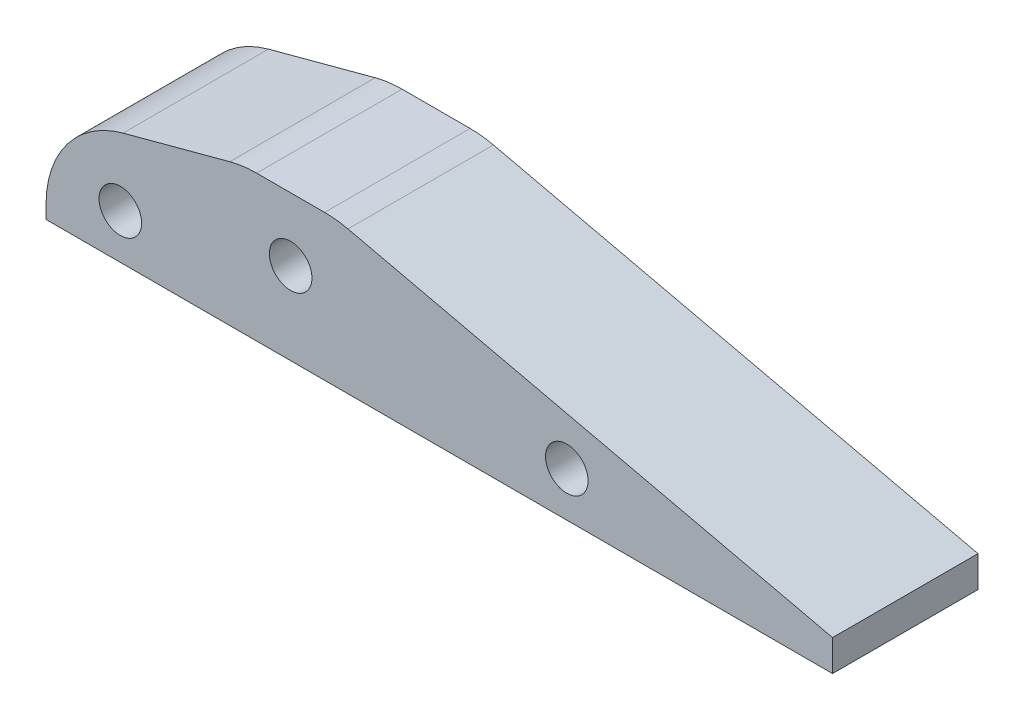
ISO-10303-21;
HEADER;
FILE_DESCRIPTION(('STEP AP214'),'2;1');
FILE_NAME('part.step','',(''),(''),'','','');
FILE_SCHEMA(('AUTOMOTIVE_DESIGN { 1 0 10303 214 1 1 1 1 }'));
ENDSEC;
DATA;
#1=APPLICATION_CONTEXT('core data for automotive mechanical design processes');
#2=APPLICATION_PROTOCOL_DEFINITION('international standard','automotive_design',2000,#1);
#3=PRODUCT_CONTEXT('',#1,'mechanical');
#4=PRODUCT('Part','Part','',(#3));
#5=PRODUCT_RELATED_PRODUCT_CATEGORY('part','',(#4));
#6=PRODUCT_DEFINITION_FORMATION('','',#4);
#7=PRODUCT_DEFINITION_CONTEXT('part definition',#1,'design');
#8=PRODUCT_DEFINITION('design','',#6,#7);
#9=PRODUCT_DEFINITION_SHAPE('','',#8);
#10=(LENGTH_UNIT() NAMED_UNIT(*) SI_UNIT(.MILLI.,.METRE.));
#11=(NAMED_UNIT(*) PLANE_ANGLE_UNIT() SI_UNIT($,.RADIAN.));
#12=(NAMED_UNIT(*) SI_UNIT($,.STERADIAN.) SOLID_ANGLE_UNIT());
#13=UNCERTAINTY_MEASURE_WITH_UNIT(LENGTH_MEASURE(1.E-05),#10,'distance_accuracy_value','');
#14=(GEOMETRIC_REPRESENTATION_CONTEXT(3) GLOBAL_UNCERTAINTY_ASSIGNED_CONTEXT((#13)) GLOBAL_UNIT_ASSIGNED_CONTEXT((#10,
#11,#12)) REPRESENTATION_CONTEXT('',''));
#15=CARTESIAN_POINT('',(0.,0.,0.));
#16=DIRECTION('',(0.,0.,1.));
#17=DIRECTION('',(1.,0.,0.));
#18=AXIS2_PLACEMENT_3D('',#15,#16,#17);
#19=CARTESIAN_POINT('',(75.7081636477034,0.,14.));
#20=DIRECTION('',(0.,1.,0.));
#21=DIRECTION('',(-1.,0.,0.));
#22=AXIS2_PLACEMENT_3D('',#19,#20,#21);
#23=PLANE('',#22);
#24=DIRECTION('',(1.,0.,0.));
#25=VECTOR('',#24,1.);
#26=CARTESIAN_POINT('',(75.7081636477034,0.,0.));
#27=LINE('',#26,#25);
#28=CARTESIAN_POINT('',(0.,0.,0.));
#29=VERTEX_POINT('',#28);
#30=CARTESIAN_POINT('',(75.7081636477034,0.,0.));
#31=VERTEX_POINT('',#30);
#32=EDGE_CURVE('E355',#29,#31,#27,.T.);
#33=ORIENTED_EDGE('',*,*,#32,.T.);
#34=DIRECTION('',(0.,0.,-1.));
#35=VECTOR('',#34,1.);
#36=CARTESIAN_POINT('',(75.7081636477034,0.,14.));
#37=LINE('',#36,#35);
#38=CARTESIAN_POINT('',(75.7081636477034,0.,14.));
#39=VERTEX_POINT('',#38);
#40=EDGE_CURVE('E401',#39,#31,#37,.T.);
#41=ORIENTED_EDGE('',*,*,#40,.F.);
#42=DIRECTION('',(1.,0.,0.));
#43=VECTOR('',#42,1.);
#44=CARTESIAN_POINT('',(75.7081636477034,0.,14.));
#45=LINE('',#44,#43);
#46=CARTESIAN_POINT('',(0.,0.,14.));
#47=VERTEX_POINT('',#46);
#48=EDGE_CURVE('E366',#47,#39,#45,.T.);
#49=ORIENTED_EDGE('',*,*,#48,.F.);
#50=DIRECTION('',(0.,0.,-1.));
#51=VECTOR('',#50,1.);
#52=CARTESIAN_POINT('',(0.,0.,14.));
#53=LINE('',#52,#51);
#54=EDGE_CURVE('E382',#47,#29,#53,.T.);
#55=ORIENTED_EDGE('',*,*,#54,.T.);
#56=EDGE_LOOP('',(#33,#41,#49,#55));
#57=FACE_BOUND('',#56,.T.);
#58=ADVANCED_FACE('F34',(#57),#23,.F.);
#59=CARTESIAN_POINT('',(75.7081636477034,3.,14.));
#60=DIRECTION('',(-1.,0.,0.));
#61=DIRECTION('',(0.,0.,1.));
#62=AXIS2_PLACEMENT_3D('',#59,#60,#61);
#63=PLANE('',#62);
#64=DIRECTION('',(0.,1.,0.));
#65=VECTOR('',#64,1.);
#66=CARTESIAN_POINT('',(75.7081636477034,3.,0.));
#67=LINE('',#66,#65);
#68=CARTESIAN_POINT('',(75.7081636477034,3.,0.));
#69=VERTEX_POINT('',#68);
#70=EDGE_CURVE('E385',#31,#69,#67,.T.);
#71=ORIENTED_EDGE('',*,*,#70,.T.);
#72=DIRECTION('',(0.,0.,-1.));
#73=VECTOR('',#72,1.);
#74=CARTESIAN_POINT('',(75.7081636477034,3.,14.));
#75=LINE('',#74,#73);
#76=CARTESIAN_POINT('',(75.7081636477034,3.,14.));
#77=VERTEX_POINT('',#76);
#78=EDGE_CURVE('E398',#77,#69,#75,.T.);
#79=ORIENTED_EDGE('',*,*,#78,.F.);
#80=DIRECTION('',(0.,1.,0.));
#81=VECTOR('',#80,1.);
#82=CARTESIAN_POINT('',(75.7081636477034,3.,14.));
#83=LINE('',#82,#81);
#84=EDGE_CURVE('E369',#39,#77,#83,.T.);
#85=ORIENTED_EDGE('',*,*,#84,.F.);
#86=ORIENTED_EDGE('',*,*,#40,.T.);
#87=EDGE_LOOP('',(#71,#79,#85,#86));
#88=FACE_BOUND('',#87,.T.);
#89=ADVANCED_FACE('F448',(#88),#63,.F.);
#90=CARTESIAN_POINT('',(27.9588181024501,14.,14.));
#91=DIRECTION('',(-0.224489795918367,-0.974476439699047,0.));
#92=DIRECTION('',(0.974476439699047,-0.224489795918367,0.));
#93=AXIS2_PLACEMENT_3D('',#90,#91,#92);
#94=PLANE('',#93);
#95=DIRECTION('',(-0.974476439699047,0.224489795918367,0.));
#96=VECTOR('',#95,1.);
#97=CARTESIAN_POINT('',(27.9588181024501,14.,0.));
#98=LINE('',#97,#96);
#99=CARTESIAN_POINT('',(29.0667574664095,13.7447643969905,0.));
#100=VERTEX_POINT('',#99);
#101=EDGE_CURVE('E387',#69,#100,#98,.T.);
#102=ORIENTED_EDGE('',*,*,#101,.T.);
#103=DIRECTION('',(0.,0.,-1.));
#104=VECTOR('',#103,1.);
#105=CARTESIAN_POINT('',(29.0667574664095,13.7447643969905,14.));
#106=LINE('',#105,#104);
#107=CARTESIAN_POINT('',(29.0667574664095,13.7447643969905,14.));
#108=VERTEX_POINT('',#107);
#109=EDGE_CURVE('E424',#100,#108,#106,.F.);
#110=ORIENTED_EDGE('',*,*,#109,.T.);
#111=DIRECTION('',(-0.974476439699047,0.224489795918367,0.));
#112=VECTOR('',#111,1.);
#113=CARTESIAN_POINT('',(27.9588181024501,14.,14.));
#114=LINE('',#113,#112);
#115=EDGE_CURVE('E372',#77,#108,#114,.T.);
#116=ORIENTED_EDGE('',*,*,#115,.F.);
#117=ORIENTED_EDGE('',*,*,#78,.T.);
#118=EDGE_LOOP('',(#102,#110,#116,#117));
#119=FACE_BOUND('',#118,.T.);
#120=ADVANCED_FACE('F445',(#119),#94,.F.);
#121=CARTESIAN_POINT('',(18.9588181024501,14.,14.));
#122=DIRECTION('',(0.,-1.,0.));
#123=DIRECTION('',(0.,0.,-1.));
#124=AXIS2_PLACEMENT_3D('',#121,#122,#123);
#125=PLANE('',#124);
#126=DIRECTION('',(-1.,0.,0.));
#127=VECTOR('',#126,1.);
#128=CARTESIAN_POINT('',(18.9588181024501,14.,14.));
#129=LINE('',#128,#127);
#130=CARTESIAN_POINT('',(26.8218595072258,14.,14.));
#131=VERTEX_POINT('',#130);
#132=CARTESIAN_POINT('',(20.275343078324,14.,14.));
#133=VERTEX_POINT('',#132);
#134=EDGE_CURVE('E375',#131,#133,#129,.T.);
#135=ORIENTED_EDGE('',*,*,#134,.F.);
#136=DIRECTION('',(0.,0.,-1.));
#137=VECTOR('',#136,1.);
#138=CARTESIAN_POINT('',(26.8218595072258,14.,14.));
#139=LINE('',#138,#137);
#140=CARTESIAN_POINT('',(26.8218595072258,14.,0.));
#141=VERTEX_POINT('',#140);
#142=EDGE_CURVE('E417',#131,#141,#139,.T.);
#143=ORIENTED_EDGE('',*,*,#142,.T.);
#144=DIRECTION('',(-1.,0.,0.));
#145=VECTOR('',#144,1.);
#146=CARTESIAN_POINT('',(18.9588181024501,14.,0.));
#147=LINE('',#146,#145);
#148=CARTESIAN_POINT('',(20.275343078324,14.,0.));
#149=VERTEX_POINT('',#148);
#150=EDGE_CURVE('E390',#141,#149,#147,.T.);
#151=ORIENTED_EDGE('',*,*,#150,.T.);
#152=DIRECTION('',(0.,0.,-1.));
#153=VECTOR('',#152,1.);
#154=CARTESIAN_POINT('',(20.275343078324,14.,14.));
#155=LINE('',#154,#153);
#156=EDGE_CURVE('E415',#149,#133,#155,.F.);
#157=ORIENTED_EDGE('',*,*,#156,.T.);
#158=EDGE_LOOP('',(#135,#143,#151,#157));
#159=FACE_BOUND('',#158,.T.);
#160=ADVANCED_FACE('F437',(#159),#125,.F.);
#161=CARTESIAN_POINT('',(0.,8.92,14.));
#162=DIRECTION('',(0.258819045102518,-0.965925826289069,0.));
#163=DIRECTION('',(0.965925826289069,0.258819045102518,0.));
#164=AXIS2_PLACEMENT_3D('',#161,#162,#163);
#165=PLANE('',#164);
#166=DIRECTION('',(-0.965925826289069,-0.258819045102518,0.));
#167=VECTOR('',#166,1.);
#168=CARTESIAN_POINT('',(0.,8.92,14.));
#169=LINE('',#168,#167);
#170=CARTESIAN_POINT('',(17.6871526272989,13.6592582628907,14.));
#171=VERTEX_POINT('',#170);
#172=CARTESIAN_POINT('',(7.41180954897482,10.9059883831011,14.));
#173=VERTEX_POINT('',#172);
#174=EDGE_CURVE('E378',#171,#173,#169,.T.);
#175=ORIENTED_EDGE('',*,*,#174,.F.);
#176=DIRECTION('',(0.,0.,-1.));
#177=VECTOR('',#176,1.);
#178=CARTESIAN_POINT('',(17.6871526272989,13.6592582628907,14.));
#179=LINE('',#178,#177);
#180=CARTESIAN_POINT('',(17.6871526272989,13.6592582628907,0.));
#181=VERTEX_POINT('',#180);
#182=EDGE_CURVE('E11',#171,#181,#179,.T.);
#183=ORIENTED_EDGE('',*,*,#182,.T.);
#184=DIRECTION('',(-0.965925826289069,-0.258819045102518,0.));
#185=VECTOR('',#184,1.);
#186=CARTESIAN_POINT('',(0.,8.92,0.));
#187=LINE('',#186,#185);
#188=CARTESIAN_POINT('',(7.41180954897482,10.9059883831011,0.));
#189=VERTEX_POINT('',#188);
#190=EDGE_CURVE('E393',#181,#189,#187,.T.);
#191=ORIENTED_EDGE('',*,*,#190,.T.);
#192=DIRECTION('',(0.,0.,-1.));
#193=VECTOR('',#192,1.);
#194=CARTESIAN_POINT('',(7.41180954897482,10.9059883831011,14.));
#195=LINE('',#194,#193);
#196=EDGE_CURVE('E410',#189,#173,#195,.F.);
#197=ORIENTED_EDGE('',*,*,#196,.T.);
#198=EDGE_LOOP('',(#175,#183,#191,#197));
#199=FACE_BOUND('',#198,.T.);
#200=ADVANCED_FACE('F466',(#199),#165,.F.);
#201=CARTESIAN_POINT('',(0.,0.,14.));
#202=DIRECTION('',(1.,0.,0.));
#203=DIRECTION('',(0.,0.,-1.));
#204=AXIS2_PLACEMENT_3D('',#201,#202,#203);
#205=PLANE('',#204);
#206=DIRECTION('',(0.,-1.,0.));
#207=VECTOR('',#206,1.);
#208=CARTESIAN_POINT('',(0.,0.,14.));
#209=LINE('',#208,#207);
#210=CARTESIAN_POINT('',(0.,1.24673012021037,14.));
#211=VERTEX_POINT('',#210);
#212=EDGE_CURVE('E380',#211,#47,#209,.T.);
#213=ORIENTED_EDGE('',*,*,#212,.F.);
#214=DIRECTION('',(0.,0.,-1.));
#215=VECTOR('',#214,1.);
#216=CARTESIAN_POINT('',(0.,1.24673012021037,14.));
#217=LINE('',#216,#215);
#218=CARTESIAN_POINT('',(0.,1.24673012021037,0.));
#219=VERTEX_POINT('',#218);
#220=EDGE_CURVE('E404',#211,#219,#217,.T.);
#221=ORIENTED_EDGE('',*,*,#220,.T.);
#222=DIRECTION('',(0.,-1.,0.));
#223=VECTOR('',#222,1.);
#224=CARTESIAN_POINT('',(0.,0.,0.));
#225=LINE('',#224,#223);
#226=EDGE_CURVE('E370',#219,#29,#225,.T.);
#227=ORIENTED_EDGE('',*,*,#226,.T.);
#228=ORIENTED_EDGE('',*,*,#54,.F.);
#229=EDGE_LOOP('',(#213,#221,#227,#228));
#230=FACE_BOUND('',#229,.T.);
#231=ADVANCED_FACE('F457',(#230),#205,.F.);
#232=CARTESIAN_POINT('',(0.,0.,14.));
#233=DIRECTION('',(0.,0.,-1.));
#234=DIRECTION('',(-1.,0.,0.));
#235=AXIS2_PLACEMENT_3D('',#232,#233,#234);
#236=PLANE('',#235);
#237=CARTESIAN_POINT('',(23.5486012927749,7.90688835550412,14.));
#238=DIRECTION('',(0.,0.,-1.));
#239=DIRECTION('',(-1.,0.,0.));
#240=AXIS2_PLACEMENT_3D('',#237,#238,#239);
#241=CIRCLE('',#240,2.05);
#242=CARTESIAN_POINT('',(21.4986012927749,7.90688835550412,14.));
#243=VERTEX_POINT('',#242);
#244=EDGE_CURVE('E823',#243,#243,#241,.T.);
#245=ORIENTED_EDGE('',*,*,#244,.T.);
#246=EDGE_LOOP('',(#245));
#247=FACE_BOUND('',#246,.T.);
#248=CARTESIAN_POINT('',(7.15500446756323,4.29359135241486,14.));
#249=DIRECTION('',(0.,0.,-1.));
#250=DIRECTION('',(-1.,0.,0.));
#251=AXIS2_PLACEMENT_3D('',#248,#249,#250);
#252=CIRCLE('',#251,2.05);
#253=CARTESIAN_POINT('',(5.10500446756323,4.29359135241486,14.));
#254=VERTEX_POINT('',#253);
#255=EDGE_CURVE('E811',#254,#254,#252,.T.);
#256=ORIENTED_EDGE('',*,*,#255,.T.);
#257=EDGE_LOOP('',(#256));
#258=FACE_BOUND('',#257,.T.);
#259=CARTESIAN_POINT('',(50.1296462146624,4.29359135241486,14.));
#260=DIRECTION('',(0.,0.,-1.));
#261=DIRECTION('',(-1.,0.,0.));
#262=AXIS2_PLACEMENT_3D('',#259,#260,#261);
#263=CIRCLE('',#262,2.04999999999999);
#264=CARTESIAN_POINT('',(48.0796462146624,4.29359135241486,14.));
#265=VERTEX_POINT('',#264);
#266=EDGE_CURVE('E294',#265,#265,#263,.T.);
#267=ORIENTED_EDGE('',*,*,#266,.T.);
#268=EDGE_LOOP('',(#267));
#269=FACE_BOUND('',#268,.T.);
#270=ORIENTED_EDGE('',*,*,#115,.T.);
#271=CARTESIAN_POINT('',(26.8218595072258,3.99999999999999,14.));
#272=DIRECTION('',(0.,0.,-1.));
#273=DIRECTION('',(-1.,0.,0.));
#274=AXIS2_PLACEMENT_3D('',#271,#272,#273);
#275=CIRCLE('',#274,10.);
#276=EDGE_CURVE('E42',#108,#131,#275,.F.);
#277=ORIENTED_EDGE('',*,*,#276,.T.);
#278=ORIENTED_EDGE('',*,*,#134,.T.);
#279=CARTESIAN_POINT('',(20.275343078324,3.99999999999999,14.));
#280=DIRECTION('',(0.,0.,-1.));
#281=DIRECTION('',(-1.,0.,0.));
#282=AXIS2_PLACEMENT_3D('',#279,#280,#281);
#283=CIRCLE('',#282,10.);
#284=EDGE_CURVE('E426',#133,#171,#283,.F.);
#285=ORIENTED_EDGE('',*,*,#284,.T.);
#286=ORIENTED_EDGE('',*,*,#174,.T.);
#287=CARTESIAN_POINT('',(10.,1.24673012021037,14.));
#288=DIRECTION('',(0.,0.,-1.));
#289=DIRECTION('',(-1.,0.,0.));
#290=AXIS2_PLACEMENT_3D('',#287,#288,#289);
#291=CIRCLE('',#290,10.);
#292=EDGE_CURVE('E413',#173,#211,#291,.F.);
#293=ORIENTED_EDGE('',*,*,#292,.T.);
#294=ORIENTED_EDGE('',*,*,#212,.T.);
#295=ORIENTED_EDGE('',*,*,#48,.T.);
#296=ORIENTED_EDGE('',*,*,#84,.T.);
#297=EDGE_LOOP('',(#270,#277,#278,#285,#286,#293,#294,#295,#296));
#298=FACE_BOUND('',#297,.T.);
#299=ADVANCED_FACE('F430',(#247,#258,#269,#298),#236,.F.);
#300=CARTESIAN_POINT('',(0.,0.,0.));
#301=DIRECTION('',(0.,0.,-1.));
#302=DIRECTION('',(-1.,0.,0.));
#303=AXIS2_PLACEMENT_3D('',#300,#301,#302);
#304=PLANE('',#303);
#305=DIRECTION('',(1.,0.,0.));
#306=VECTOR('',#305,1.);
#307=CARTESIAN_POINT('',(21.4990078371518,11.4568883555041,0.));
#308=LINE('',#307,#306);
#309=CARTESIAN_POINT('',(21.4990078371518,11.4568883555041,0.));
#310=VERTEX_POINT('',#309);
#311=CARTESIAN_POINT('',(25.5981947483981,11.4568883555041,0.));
#312=VERTEX_POINT('',#311);
#313=EDGE_CURVE('E49',#310,#312,#308,.T.);
#314=ORIENTED_EDGE('',*,*,#313,.F.);
#315=DIRECTION('',(0.500000000000008,0.866025403784434,0.));
#316=VECTOR('',#315,1.);
#317=CARTESIAN_POINT('',(19.4494143815286,7.90688835550415,0.));
#318=LINE('',#317,#316);
#319=CARTESIAN_POINT('',(19.4494143815286,7.90688835550415,0.));
#320=VERTEX_POINT('',#319);
#321=EDGE_CURVE('E234',#320,#310,#318,.T.);
#322=ORIENTED_EDGE('',*,*,#321,.F.);
#323=DIRECTION('',(-0.499999999999994,0.866025403784442,0.));
#324=VECTOR('',#323,1.);
#325=CARTESIAN_POINT('',(21.4990078371517,4.35688835550413,0.));
#326=LINE('',#325,#324);
#327=CARTESIAN_POINT('',(21.4990078371517,4.35688835550413,0.));
#328=VERTEX_POINT('',#327);
#329=EDGE_CURVE('E237',#328,#320,#326,.T.);
#330=ORIENTED_EDGE('',*,*,#329,.F.);
#331=DIRECTION('',(-1.,0.,0.));
#332=VECTOR('',#331,1.);
#333=CARTESIAN_POINT('',(25.5981947483981,4.35688835550411,0.));
#334=LINE('',#333,#332);
#335=CARTESIAN_POINT('',(25.5981947483981,4.35688835550411,0.));
#336=VERTEX_POINT('',#335);
#337=EDGE_CURVE('E257',#336,#328,#334,.T.);
#338=ORIENTED_EDGE('',*,*,#337,.F.);
#339=DIRECTION('',(-0.500000000000003,-0.866025403784437,0.));
#340=VECTOR('',#339,1.);
#341=CARTESIAN_POINT('',(27.6477882040213,7.90688835550411,0.));
#342=LINE('',#341,#340);
#343=CARTESIAN_POINT('',(27.6477882040213,7.90688835550411,0.));
#344=VERTEX_POINT('',#343);
#345=EDGE_CURVE('E254',#344,#336,#342,.T.);
#346=ORIENTED_EDGE('',*,*,#345,.F.);
#347=DIRECTION('',(0.5,-0.866025403784439,0.));
#348=VECTOR('',#347,1.);
#349=CARTESIAN_POINT('',(25.5981947483981,11.4568883555041,0.));
#350=LINE('',#349,#348);
#351=EDGE_CURVE('E251',#312,#344,#350,.T.);
#352=ORIENTED_EDGE('',*,*,#351,.F.);
#353=EDGE_LOOP('',(#314,#322,#330,#338,#346,#352));
#354=FACE_BOUND('',#353,.T.);
#355=DIRECTION('',(1.,0.,0.));
#356=VECTOR('',#355,1.);
#357=CARTESIAN_POINT('',(5.1054110119401,7.84359135241489,0.));
#358=LINE('',#357,#356);
#359=CARTESIAN_POINT('',(5.1054110119401,7.84359135241489,0.));
#360=VERTEX_POINT('',#359);
#361=CARTESIAN_POINT('',(9.2045979231864,7.84359135241486,0.));
#362=VERTEX_POINT('',#361);
#363=EDGE_CURVE('E57',#360,#362,#358,.T.);
#364=ORIENTED_EDGE('',*,*,#363,.F.);
#365=DIRECTION('',(0.50000000000001,0.866025403784433,0.));
#366=VECTOR('',#365,1.);
#367=CARTESIAN_POINT('',(3.05581755631689,4.2935913524149,0.));
#368=LINE('',#367,#366);
#369=CARTESIAN_POINT('',(3.05581755631689,4.2935913524149,0.));
#370=VERTEX_POINT('',#369);
#371=EDGE_CURVE('E276',#370,#360,#368,.T.);
#372=ORIENTED_EDGE('',*,*,#371,.F.);
#373=DIRECTION('',(-0.499999999999993,0.866025403784443,0.));
#374=VECTOR('',#373,1.);
#375=CARTESIAN_POINT('',(5.10541101194003,0.743591352414876,0.));
#376=LINE('',#375,#374);
#377=CARTESIAN_POINT('',(5.10541101194003,0.743591352414876,0.));
#378=VERTEX_POINT('',#377);
#379=EDGE_CURVE('E303',#378,#370,#376,.T.);
#380=ORIENTED_EDGE('',*,*,#379,.F.);
#381=DIRECTION('',(-1.,0.,0.));
#382=VECTOR('',#381,1.);
#383=CARTESIAN_POINT('',(9.20459792318639,0.74359135241485,0.));
#384=LINE('',#383,#382);
#385=CARTESIAN_POINT('',(9.20459792318639,0.74359135241485,0.));
#386=VERTEX_POINT('',#385);
#387=EDGE_CURVE('E300',#386,#378,#384,.T.);
#388=ORIENTED_EDGE('',*,*,#387,.F.);
#389=DIRECTION('',(-0.500000000000003,-0.866025403784437,0.));
#390=VECTOR('',#389,1.);
#391=CARTESIAN_POINT('',(11.2541913788096,4.29359135241485,0.));
#392=LINE('',#391,#390);
#393=CARTESIAN_POINT('',(11.2541913788096,4.29359135241485,0.));
#394=VERTEX_POINT('',#393);
#395=EDGE_CURVE('E297',#394,#386,#392,.T.);
#396=ORIENTED_EDGE('',*,*,#395,.F.);
#397=DIRECTION('',(0.499999999999999,-0.866025403784439,0.));
#398=VECTOR('',#397,1.);
#399=CARTESIAN_POINT('',(9.2045979231864,7.84359135241486,0.));
#400=LINE('',#399,#398);
#401=EDGE_CURVE('E293',#362,#394,#400,.T.);
#402=ORIENTED_EDGE('',*,*,#401,.F.);
#403=EDGE_LOOP('',(#364,#372,#380,#388,#396,#402));
#404=FACE_BOUND('',#403,.T.);
#405=DIRECTION('',(1.,0.,0.));
#406=VECTOR('',#405,1.);
#407=CARTESIAN_POINT('',(48.0800527590393,7.8435913524149,0.));
#408=LINE('',#407,#406);
#409=CARTESIAN_POINT('',(48.0800527590393,7.8435913524149,0.));
#410=VERTEX_POINT('',#409);
#411=CARTESIAN_POINT('',(52.1792396702856,7.84359135241487,0.));
#412=VERTEX_POINT('',#411);
#413=EDGE_CURVE('E264',#410,#412,#408,.T.);
#414=ORIENTED_EDGE('',*,*,#413,.F.);
#415=DIRECTION('',(0.50000000000001,0.866025403784433,0.));
#416=VECTOR('',#415,1.);
#417=CARTESIAN_POINT('',(46.0304593034161,4.2935913524149,0.));
#418=LINE('',#417,#416);
#419=CARTESIAN_POINT('',(46.0304593034161,4.2935913524149,0.));
#420=VERTEX_POINT('',#419);
#421=EDGE_CURVE('E322',#420,#410,#418,.T.);
#422=ORIENTED_EDGE('',*,*,#421,.F.);
#423=DIRECTION('',(-0.499999999999992,0.866025403784443,0.));
#424=VECTOR('',#423,1.);
#425=CARTESIAN_POINT('',(48.0800527590392,0.743591352414869,0.));
#426=LINE('',#425,#424);
#427=CARTESIAN_POINT('',(48.0800527590392,0.743591352414869,0.));
#428=VERTEX_POINT('',#427);
#429=EDGE_CURVE('E348',#428,#420,#426,.T.);
#430=ORIENTED_EDGE('',*,*,#429,.F.);
#431=DIRECTION('',(-1.,0.,0.));
#432=VECTOR('',#431,1.);
#433=CARTESIAN_POINT('',(52.1792396702856,0.743591352414841,0.));
#434=LINE('',#433,#432);
#435=CARTESIAN_POINT('',(52.1792396702856,0.743591352414841,0.));
#436=VERTEX_POINT('',#435);
#437=EDGE_CURVE('E345',#436,#428,#434,.T.);
#438=ORIENTED_EDGE('',*,*,#437,.F.);
#439=DIRECTION('',(-0.500000000000003,-0.866025403784437,0.));
#440=VECTOR('',#439,1.);
#441=CARTESIAN_POINT('',(54.2288331259088,4.29359135241485,0.));
#442=LINE('',#441,#440);
#443=CARTESIAN_POINT('',(54.2288331259088,4.29359135241485,0.));
#444=VERTEX_POINT('',#443);
#445=EDGE_CURVE('E342',#444,#436,#442,.T.);
#446=ORIENTED_EDGE('',*,*,#445,.F.);
#447=DIRECTION('',(0.499999999999998,-0.86602540378444,0.));
#448=VECTOR('',#447,1.);
#449=CARTESIAN_POINT('',(52.1792396702856,7.84359135241487,0.));
#450=LINE('',#449,#448);
#451=EDGE_CURVE('E339',#412,#444,#450,.T.);
#452=ORIENTED_EDGE('',*,*,#451,.F.);
#453=EDGE_LOOP('',(#414,#422,#430,#438,#446,#452));
#454=FACE_BOUND('',#453,.T.);
#455=ORIENTED_EDGE('',*,*,#150,.F.);
#456=CARTESIAN_POINT('',(26.8218595072258,3.99999999999999,0.));
#457=DIRECTION('',(0.,0.,-1.));
#458=DIRECTION('',(-1.,0.,0.));
#459=AXIS2_PLACEMENT_3D('',#456,#457,#458);
#460=CIRCLE('',#459,10.);
#461=EDGE_CURVE('E422',#141,#100,#460,.T.);
#462=ORIENTED_EDGE('',*,*,#461,.T.);
#463=ORIENTED_EDGE('',*,*,#101,.F.);
#464=ORIENTED_EDGE('',*,*,#70,.F.);
#465=ORIENTED_EDGE('',*,*,#32,.F.);
#466=ORIENTED_EDGE('',*,*,#226,.F.);
#467=CARTESIAN_POINT('',(10.,1.24673012021037,0.));
#468=DIRECTION('',(0.,0.,-1.));
#469=DIRECTION('',(-1.,0.,0.));
#470=AXIS2_PLACEMENT_3D('',#467,#468,#469);
#471=CIRCLE('',#470,10.);
#472=EDGE_CURVE('E407',#219,#189,#471,.T.);
#473=ORIENTED_EDGE('',*,*,#472,.T.);
#474=ORIENTED_EDGE('',*,*,#190,.F.);
#475=CARTESIAN_POINT('',(20.275343078324,3.99999999999999,0.));
#476=DIRECTION('',(0.,0.,-1.));
#477=DIRECTION('',(-1.,0.,0.));
#478=AXIS2_PLACEMENT_3D('',#475,#476,#477);
#479=CIRCLE('',#478,10.);
#480=EDGE_CURVE('E420',#181,#149,#479,.T.);
#481=ORIENTED_EDGE('',*,*,#480,.T.);
#482=EDGE_LOOP('',(#455,#462,#463,#464,#465,#466,#473,#474,#481));
#483=FACE_BOUND('',#482,.T.);
#484=ADVANCED_FACE('F443',(#354,#404,#454,#483),#304,.T.);
#485=CARTESIAN_POINT('',(10.,1.24673012021037,14.));
#486=DIRECTION('',(0.,0.,-1.));
#487=DIRECTION('',(-1.,0.,0.));
#488=AXIS2_PLACEMENT_3D('',#485,#486,#487);
#489=CYLINDRICAL_SURFACE('',#488,10.);
#490=ORIENTED_EDGE('',*,*,#292,.F.);
#491=ORIENTED_EDGE('',*,*,#196,.F.);
#492=ORIENTED_EDGE('',*,*,#472,.F.);
#493=ORIENTED_EDGE('',*,*,#220,.F.);
#494=EDGE_LOOP('',(#490,#491,#492,#493));
#495=FACE_BOUND('',#494,.T.);
#496=ADVANCED_FACE('F461',(#495),#489,.T.);
#497=CARTESIAN_POINT('',(26.8218595072258,3.99999999999999,14.));
#498=DIRECTION('',(0.,0.,-1.));
#499=DIRECTION('',(-1.,0.,0.));
#500=AXIS2_PLACEMENT_3D('',#497,#498,#499);
#501=CYLINDRICAL_SURFACE('',#500,10.);
#502=ORIENTED_EDGE('',*,*,#276,.F.);
#503=ORIENTED_EDGE('',*,*,#109,.F.);
#504=ORIENTED_EDGE('',*,*,#461,.F.);
#505=ORIENTED_EDGE('',*,*,#142,.F.);
#506=EDGE_LOOP('',(#502,#503,#504,#505));
#507=FACE_BOUND('',#506,.T.);
#508=ADVANCED_FACE('F440',(#507),#501,.T.);
#509=CARTESIAN_POINT('',(20.275343078324,3.99999999999999,14.));
#510=DIRECTION('',(0.,0.,-1.));
#511=DIRECTION('',(-1.,0.,0.));
#512=AXIS2_PLACEMENT_3D('',#509,#510,#511);
#513=CYLINDRICAL_SURFACE('',#512,10.);
#514=ORIENTED_EDGE('',*,*,#284,.F.);
#515=ORIENTED_EDGE('',*,*,#156,.F.);
#516=ORIENTED_EDGE('',*,*,#480,.F.);
#517=ORIENTED_EDGE('',*,*,#182,.F.);
#518=EDGE_LOOP('',(#514,#515,#516,#517));
#519=FACE_BOUND('',#518,.T.);
#520=ADVANCED_FACE('F36',(#519),#513,.T.);
#521=CARTESIAN_POINT('',(48.0800527590393,7.8435913524149,5.));
#522=DIRECTION('',(0.,1.,0.));
#523=DIRECTION('',(-1.,0.,0.));
#524=AXIS2_PLACEMENT_3D('',#521,#522,#523);
#525=PLANE('',#524);
#526=ORIENTED_EDGE('',*,*,#413,.T.);
#527=DIRECTION('',(0.,0.,-1.));
#528=VECTOR('',#527,1.);
#529=CARTESIAN_POINT('',(52.1792396702856,7.84359135241487,5.));
#530=LINE('',#529,#528);
#531=CARTESIAN_POINT('',(52.1792396702856,7.84359135241487,5.));
#532=VERTEX_POINT('',#531);
#533=EDGE_CURVE('E337',#532,#412,#530,.T.);
#534=ORIENTED_EDGE('',*,*,#533,.F.);
#535=DIRECTION('',(1.,0.,0.));
#536=VECTOR('',#535,1.);
#537=CARTESIAN_POINT('',(48.0800527590393,7.8435913524149,5.));
#538=LINE('',#537,#536);
#539=CARTESIAN_POINT('',(48.0800527590393,7.8435913524149,5.));
#540=VERTEX_POINT('',#539);
#541=EDGE_CURVE('E318',#540,#532,#538,.T.);
#542=ORIENTED_EDGE('',*,*,#541,.F.);
#543=DIRECTION('',(0.,0.,-1.));
#544=VECTOR('',#543,1.);
#545=CARTESIAN_POINT('',(48.0800527590393,7.8435913524149,5.));
#546=LINE('',#545,#544);
#547=EDGE_CURVE('E353',#540,#410,#546,.T.);
#548=ORIENTED_EDGE('',*,*,#547,.T.);
#549=EDGE_LOOP('',(#526,#534,#542,#548));
#550=FACE_BOUND('',#549,.T.);
#551=ADVANCED_FACE('F470',(#550),#525,.F.);
#552=CARTESIAN_POINT('',(46.0304593034161,4.2935913524149,5.));
#553=DIRECTION('',(-0.866025403784433,0.50000000000001,0.));
#554=DIRECTION('',(-0.50000000000001,-0.866025403784433,0.));
#555=AXIS2_PLACEMENT_3D('',#552,#553,#554);
#556=PLANE('',#555);
#557=ORIENTED_EDGE('',*,*,#421,.T.);
#558=ORIENTED_EDGE('',*,*,#547,.F.);
#559=DIRECTION('',(0.50000000000001,0.866025403784433,0.));
#560=VECTOR('',#559,1.);
#561=CARTESIAN_POINT('',(46.0304593034161,4.2935913524149,5.));
#562=LINE('',#561,#560);
#563=CARTESIAN_POINT('',(46.0304593034161,4.2935913524149,5.));
#564=VERTEX_POINT('',#563);
#565=EDGE_CURVE('E334',#564,#540,#562,.T.);
#566=ORIENTED_EDGE('',*,*,#565,.F.);
#567=DIRECTION('',(0.,0.,-1.));
#568=VECTOR('',#567,1.);
#569=CARTESIAN_POINT('',(46.0304593034161,4.2935913524149,5.));
#570=LINE('',#569,#568);
#571=EDGE_CURVE('E356',#564,#420,#570,.T.);
#572=ORIENTED_EDGE('',*,*,#571,.T.);
#573=EDGE_LOOP('',(#557,#558,#566,#572));
#574=FACE_BOUND('',#573,.T.);
#575=ADVANCED_FACE('F475',(#574),#556,.F.);
#576=CARTESIAN_POINT('',(48.0800527590392,0.743591352414869,5.));
#577=DIRECTION('',(-0.866025403784443,-0.499999999999992,0.));
#578=DIRECTION('',(0.499999999999992,-0.866025403784443,0.));
#579=AXIS2_PLACEMENT_3D('',#576,#577,#578);
#580=PLANE('',#579);
#581=ORIENTED_EDGE('',*,*,#429,.T.);
#582=ORIENTED_EDGE('',*,*,#571,.F.);
#583=DIRECTION('',(-0.499999999999992,0.866025403784443,0.));
#584=VECTOR('',#583,1.);
#585=CARTESIAN_POINT('',(48.0800527590392,0.743591352414869,5.));
#586=LINE('',#585,#584);
#587=CARTESIAN_POINT('',(48.0800527590392,0.743591352414869,5.));
#588=VERTEX_POINT('',#587);
#589=EDGE_CURVE('E331',#588,#564,#586,.T.);
#590=ORIENTED_EDGE('',*,*,#589,.F.);
#591=DIRECTION('',(0.,0.,-1.));
#592=VECTOR('',#591,1.);
#593=CARTESIAN_POINT('',(48.0800527590392,0.743591352414869,5.));
#594=LINE('',#593,#592);
#595=EDGE_CURVE('E358',#588,#428,#594,.T.);
#596=ORIENTED_EDGE('',*,*,#595,.T.);
#597=EDGE_LOOP('',(#581,#582,#590,#596));
#598=FACE_BOUND('',#597,.T.);
#599=ADVANCED_FACE('F648',(#598),#580,.F.);
#600=CARTESIAN_POINT('',(52.1792396702856,0.743591352414841,5.));
#601=DIRECTION('',(0.,-1.,0.));
#602=DIRECTION('',(1.,0.,0.));
#603=AXIS2_PLACEMENT_3D('',#600,#601,#602);
#604=PLANE('',#603);
#605=ORIENTED_EDGE('',*,*,#437,.T.);
#606=ORIENTED_EDGE('',*,*,#595,.F.);
#607=DIRECTION('',(-1.,0.,0.));
#608=VECTOR('',#607,1.);
#609=CARTESIAN_POINT('',(52.1792396702856,0.743591352414841,5.));
#610=LINE('',#609,#608);
#611=CARTESIAN_POINT('',(52.1792396702856,0.743591352414841,5.));
#612=VERTEX_POINT('',#611);
#613=EDGE_CURVE('E328',#612,#588,#610,.T.);
#614=ORIENTED_EDGE('',*,*,#613,.F.);
#615=DIRECTION('',(0.,0.,-1.));
#616=VECTOR('',#615,1.);
#617=CARTESIAN_POINT('',(52.1792396702856,0.743591352414841,5.));
#618=LINE('',#617,#616);
#619=EDGE_CURVE('E360',#612,#436,#618,.T.);
#620=ORIENTED_EDGE('',*,*,#619,.T.);
#621=EDGE_LOOP('',(#605,#606,#614,#620));
#622=FACE_BOUND('',#621,.T.);
#623=ADVANCED_FACE('F652',(#622),#604,.F.);
#624=CARTESIAN_POINT('',(54.2288331259088,4.29359135241485,5.));
#625=DIRECTION('',(0.866025403784437,-0.500000000000003,0.));
#626=DIRECTION('',(0.500000000000004,0.866025403784437,0.));
#627=AXIS2_PLACEMENT_3D('',#624,#625,#626);
#628=PLANE('',#627);
#629=ORIENTED_EDGE('',*,*,#445,.T.);
#630=ORIENTED_EDGE('',*,*,#619,.F.);
#631=DIRECTION('',(-0.500000000000003,-0.866025403784437,0.));
#632=VECTOR('',#631,1.);
#633=CARTESIAN_POINT('',(54.2288331259088,4.29359135241485,5.));
#634=LINE('',#633,#632);
#635=CARTESIAN_POINT('',(54.2288331259088,4.29359135241485,5.));
#636=VERTEX_POINT('',#635);
#637=EDGE_CURVE('E325',#636,#612,#634,.T.);
#638=ORIENTED_EDGE('',*,*,#637,.F.);
#639=DIRECTION('',(0.,0.,-1.));
#640=VECTOR('',#639,1.);
#641=CARTESIAN_POINT('',(54.2288331259088,4.29359135241485,5.));
#642=LINE('',#641,#640);
#643=EDGE_CURVE('E362',#636,#444,#642,.T.);
#644=ORIENTED_EDGE('',*,*,#643,.T.);
#645=EDGE_LOOP('',(#629,#630,#638,#644));
#646=FACE_BOUND('',#645,.T.);
#647=ADVANCED_FACE('F656',(#646),#628,.F.);
#648=CARTESIAN_POINT('',(52.1792396702856,7.84359135241487,5.));
#649=DIRECTION('',(0.86602540378444,0.499999999999998,0.));
#650=DIRECTION('',(-0.499999999999998,0.86602540378444,0.));
#651=AXIS2_PLACEMENT_3D('',#648,#649,#650);
#652=PLANE('',#651);
#653=ORIENTED_EDGE('',*,*,#451,.T.);
#654=ORIENTED_EDGE('',*,*,#643,.F.);
#655=DIRECTION('',(0.499999999999998,-0.86602540378444,0.));
#656=VECTOR('',#655,1.);
#657=CARTESIAN_POINT('',(52.1792396702856,7.84359135241487,5.));
#658=LINE('',#657,#656);
#659=EDGE_CURVE('E321',#532,#636,#658,.T.);
#660=ORIENTED_EDGE('',*,*,#659,.F.);
#661=ORIENTED_EDGE('',*,*,#533,.T.);
#662=EDGE_LOOP('',(#653,#654,#660,#661));
#663=FACE_BOUND('',#662,.T.);
#664=ADVANCED_FACE('F543',(#663),#652,.F.);
#665=CARTESIAN_POINT('',(0.,0.,5.));
#666=DIRECTION('',(0.,0.,-1.));
#667=DIRECTION('',(-1.,0.,0.));
#668=AXIS2_PLACEMENT_3D('',#665,#666,#667);
#669=PLANE('',#668);
#670=CARTESIAN_POINT('',(50.1296462146624,4.29359135241486,5.));
#671=DIRECTION('',(0.,0.,-1.));
#672=DIRECTION('',(-1.,0.,0.));
#673=AXIS2_PLACEMENT_3D('',#670,#671,#672);
#674=CIRCLE('',#673,2.04999999999999);
#675=CARTESIAN_POINT('',(48.0796462146624,4.29359135241486,5.));
#676=VERTEX_POINT('',#675);
#677=EDGE_CURVE('E240',#676,#676,#674,.T.);
#678=ORIENTED_EDGE('',*,*,#677,.F.);
#679=EDGE_LOOP('',(#678));
#680=FACE_BOUND('',#679,.T.);
#681=ORIENTED_EDGE('',*,*,#541,.T.);
#682=ORIENTED_EDGE('',*,*,#659,.T.);
#683=ORIENTED_EDGE('',*,*,#637,.T.);
#684=ORIENTED_EDGE('',*,*,#613,.T.);
#685=ORIENTED_EDGE('',*,*,#589,.T.);
#686=ORIENTED_EDGE('',*,*,#565,.T.);
#687=EDGE_LOOP('',(#681,#682,#683,#684,#685,#686));
#688=FACE_BOUND('',#687,.T.);
#689=ADVANCED_FACE('F537',(#680,#688),#669,.T.);
#690=CARTESIAN_POINT('',(5.1054110119401,7.84359135241489,5.));
#691=DIRECTION('',(0.,1.,0.));
#692=DIRECTION('',(-1.,0.,0.));
#693=AXIS2_PLACEMENT_3D('',#690,#691,#692);
#694=PLANE('',#693);
#695=ORIENTED_EDGE('',*,*,#363,.T.);
#696=DIRECTION('',(0.,0.,-1.));
#697=VECTOR('',#696,1.);
#698=CARTESIAN_POINT('',(9.2045979231864,7.84359135241486,5.));
#699=LINE('',#698,#697);
#700=CARTESIAN_POINT('',(9.2045979231864,7.84359135241486,5.));
#701=VERTEX_POINT('',#700);
#702=EDGE_CURVE('E291',#701,#362,#699,.T.);
#703=ORIENTED_EDGE('',*,*,#702,.F.);
#704=DIRECTION('',(1.,0.,0.));
#705=VECTOR('',#704,1.);
#706=CARTESIAN_POINT('',(5.1054110119401,7.84359135241489,5.));
#707=LINE('',#706,#705);
#708=CARTESIAN_POINT('',(5.1054110119401,7.84359135241489,5.));
#709=VERTEX_POINT('',#708);
#710=EDGE_CURVE('E272',#709,#701,#707,.T.);
#711=ORIENTED_EDGE('',*,*,#710,.F.);
#712=DIRECTION('',(0.,0.,-1.));
#713=VECTOR('',#712,1.);
#714=CARTESIAN_POINT('',(5.1054110119401,7.84359135241489,5.));
#715=LINE('',#714,#713);
#716=EDGE_CURVE('E252',#709,#360,#715,.T.);
#717=ORIENTED_EDGE('',*,*,#716,.T.);
#718=EDGE_LOOP('',(#695,#703,#711,#717));
#719=FACE_BOUND('',#718,.T.);
#720=ADVANCED_FACE('F542',(#719),#694,.F.);
#721=CARTESIAN_POINT('',(3.05581755631689,4.2935913524149,5.));
#722=DIRECTION('',(-0.866025403784433,0.500000000000009,0.));
#723=DIRECTION('',(-0.50000000000001,-0.866025403784433,0.));
#724=AXIS2_PLACEMENT_3D('',#721,#722,#723);
#725=PLANE('',#724);
#726=ORIENTED_EDGE('',*,*,#371,.T.);
#727=ORIENTED_EDGE('',*,*,#716,.F.);
#728=DIRECTION('',(0.50000000000001,0.866025403784433,0.));
#729=VECTOR('',#728,1.);
#730=CARTESIAN_POINT('',(3.05581755631689,4.2935913524149,5.));
#731=LINE('',#730,#729);
#732=CARTESIAN_POINT('',(3.05581755631689,4.2935913524149,5.));
#733=VERTEX_POINT('',#732);
#734=EDGE_CURVE('E288',#733,#709,#731,.T.);
#735=ORIENTED_EDGE('',*,*,#734,.F.);
#736=DIRECTION('',(0.,0.,-1.));
#737=VECTOR('',#736,1.);
#738=CARTESIAN_POINT('',(3.05581755631689,4.2935913524149,5.));
#739=LINE('',#738,#737);
#740=EDGE_CURVE('E309',#733,#370,#739,.T.);
#741=ORIENTED_EDGE('',*,*,#740,.T.);
#742=EDGE_LOOP('',(#726,#727,#735,#741));
#743=FACE_BOUND('',#742,.T.);
#744=ADVANCED_FACE('F627',(#743),#725,.F.);
#745=CARTESIAN_POINT('',(5.10541101194003,0.743591352414876,5.));
#746=DIRECTION('',(-0.866025403784443,-0.499999999999993,0.));
#747=DIRECTION('',(0.499999999999993,-0.866025403784443,0.));
#748=AXIS2_PLACEMENT_3D('',#745,#746,#747);
#749=PLANE('',#748);
#750=ORIENTED_EDGE('',*,*,#379,.T.);
#751=ORIENTED_EDGE('',*,*,#740,.F.);
#752=DIRECTION('',(-0.499999999999993,0.866025403784443,0.));
#753=VECTOR('',#752,1.);
#754=CARTESIAN_POINT('',(5.10541101194003,0.743591352414876,5.));
#755=LINE('',#754,#753);
#756=CARTESIAN_POINT('',(5.10541101194003,0.743591352414876,5.));
#757=VERTEX_POINT('',#756);
#758=EDGE_CURVE('E285',#757,#733,#755,.T.);
#759=ORIENTED_EDGE('',*,*,#758,.F.);
#760=DIRECTION('',(0.,0.,-1.));
#761=VECTOR('',#760,1.);
#762=CARTESIAN_POINT('',(5.10541101194003,0.743591352414876,5.));
#763=LINE('',#762,#761);
#764=EDGE_CURVE('E311',#757,#378,#763,.T.);
#765=ORIENTED_EDGE('',*,*,#764,.T.);
#766=EDGE_LOOP('',(#750,#751,#759,#765));
#767=FACE_BOUND('',#766,.T.);
#768=ADVANCED_FACE('F630',(#767),#749,.F.);
#769=CARTESIAN_POINT('',(9.20459792318639,0.74359135241485,5.));
#770=DIRECTION('',(0.,-1.,0.));
#771=DIRECTION('',(1.,0.,0.));
#772=AXIS2_PLACEMENT_3D('',#769,#770,#771);
#773=PLANE('',#772);
#774=ORIENTED_EDGE('',*,*,#387,.T.);
#775=ORIENTED_EDGE('',*,*,#764,.F.);
#776=DIRECTION('',(-1.,0.,0.));
#777=VECTOR('',#776,1.);
#778=CARTESIAN_POINT('',(9.20459792318639,0.74359135241485,5.));
#779=LINE('',#778,#777);
#780=CARTESIAN_POINT('',(9.20459792318639,0.74359135241485,5.));
#781=VERTEX_POINT('',#780);
#782=EDGE_CURVE('E282',#781,#757,#779,.T.);
#783=ORIENTED_EDGE('',*,*,#782,.F.);
#784=DIRECTION('',(0.,0.,-1.));
#785=VECTOR('',#784,1.);
#786=CARTESIAN_POINT('',(9.20459792318639,0.74359135241485,5.));
#787=LINE('',#786,#785);
#788=EDGE_CURVE('E313',#781,#386,#787,.T.);
#789=ORIENTED_EDGE('',*,*,#788,.T.);
#790=EDGE_LOOP('',(#774,#775,#783,#789));
#791=FACE_BOUND('',#790,.T.);
#792=ADVANCED_FACE('F634',(#791),#773,.F.);
#793=CARTESIAN_POINT('',(11.2541913788096,4.29359135241485,5.));
#794=DIRECTION('',(0.866025403784437,-0.500000000000003,0.));
#795=DIRECTION('',(0.500000000000003,0.866025403784437,0.));
#796=AXIS2_PLACEMENT_3D('',#793,#794,#795);
#797=PLANE('',#796);
#798=ORIENTED_EDGE('',*,*,#395,.T.);
#799=ORIENTED_EDGE('',*,*,#788,.F.);
#800=DIRECTION('',(-0.500000000000003,-0.866025403784437,0.));
#801=VECTOR('',#800,1.);
#802=CARTESIAN_POINT('',(11.2541913788096,4.29359135241485,5.));
#803=LINE('',#802,#801);
#804=CARTESIAN_POINT('',(11.2541913788096,4.29359135241485,5.));
#805=VERTEX_POINT('',#804);
#806=EDGE_CURVE('E279',#805,#781,#803,.T.);
#807=ORIENTED_EDGE('',*,*,#806,.F.);
#808=DIRECTION('',(0.,0.,-1.));
#809=VECTOR('',#808,1.);
#810=CARTESIAN_POINT('',(11.2541913788096,4.29359135241485,5.));
#811=LINE('',#810,#809);
#812=EDGE_CURVE('E315',#805,#394,#811,.T.);
#813=ORIENTED_EDGE('',*,*,#812,.T.);
#814=EDGE_LOOP('',(#798,#799,#807,#813));
#815=FACE_BOUND('',#814,.T.);
#816=ADVANCED_FACE('F638',(#815),#797,.F.);
#817=CARTESIAN_POINT('',(9.2045979231864,7.84359135241486,5.));
#818=DIRECTION('',(0.866025403784439,0.499999999999999,0.));
#819=DIRECTION('',(-0.499999999999999,0.866025403784439,0.));
#820=AXIS2_PLACEMENT_3D('',#817,#818,#819);
#821=PLANE('',#820);
#822=ORIENTED_EDGE('',*,*,#401,.T.);
#823=ORIENTED_EDGE('',*,*,#812,.F.);
#824=DIRECTION('',(0.499999999999999,-0.866025403784439,0.));
#825=VECTOR('',#824,1.);
#826=CARTESIAN_POINT('',(9.2045979231864,7.84359135241486,5.));
#827=LINE('',#826,#825);
#828=EDGE_CURVE('E275',#701,#805,#827,.T.);
#829=ORIENTED_EDGE('',*,*,#828,.F.);
#830=ORIENTED_EDGE('',*,*,#702,.T.);
#831=EDGE_LOOP('',(#822,#823,#829,#830));
#832=FACE_BOUND('',#831,.T.);
#833=ADVANCED_FACE('F558',(#832),#821,.F.);
#834=CARTESIAN_POINT('',(0.,0.,5.));
#835=DIRECTION('',(0.,0.,-1.));
#836=DIRECTION('',(-1.,0.,0.));
#837=AXIS2_PLACEMENT_3D('',#834,#835,#836);
#838=PLANE('',#837);
#839=CARTESIAN_POINT('',(7.15500446756323,4.29359135241486,5.));
#840=DIRECTION('',(0.,0.,-1.));
#841=DIRECTION('',(-1.,0.,0.));
#842=AXIS2_PLACEMENT_3D('',#839,#840,#841);
#843=CIRCLE('',#842,2.05);
#844=CARTESIAN_POINT('',(5.10500446756323,4.29359135241486,5.));
#845=VERTEX_POINT('',#844);
#846=EDGE_CURVE('E814',#845,#845,#843,.T.);
#847=ORIENTED_EDGE('',*,*,#846,.F.);
#848=EDGE_LOOP('',(#847));
#849=FACE_BOUND('',#848,.T.);
#850=ORIENTED_EDGE('',*,*,#710,.T.);
#851=ORIENTED_EDGE('',*,*,#828,.T.);
#852=ORIENTED_EDGE('',*,*,#806,.T.);
#853=ORIENTED_EDGE('',*,*,#782,.T.);
#854=ORIENTED_EDGE('',*,*,#758,.T.);
#855=ORIENTED_EDGE('',*,*,#734,.T.);
#856=EDGE_LOOP('',(#850,#851,#852,#853,#854,#855));
#857=FACE_BOUND('',#856,.T.);
#858=ADVANCED_FACE('F553',(#849,#857),#838,.T.);
#859=CARTESIAN_POINT('',(21.4990078371518,11.4568883555041,5.));
#860=DIRECTION('',(0.,1.,0.));
#861=DIRECTION('',(-1.,0.,0.));
#862=AXIS2_PLACEMENT_3D('',#859,#860,#861);
#863=PLANE('',#862);
#864=ORIENTED_EDGE('',*,*,#313,.T.);
#865=DIRECTION('',(0.,0.,-1.));
#866=VECTOR('',#865,1.);
#867=CARTESIAN_POINT('',(25.5981947483981,11.4568883555041,5.));
#868=LINE('',#867,#866);
#869=CARTESIAN_POINT('',(25.5981947483981,11.4568883555041,5.));
#870=VERTEX_POINT('',#869);
#871=EDGE_CURVE('E211',#870,#312,#868,.T.);
#872=ORIENTED_EDGE('',*,*,#871,.F.);
#873=DIRECTION('',(1.,0.,0.));
#874=VECTOR('',#873,1.);
#875=CARTESIAN_POINT('',(21.4990078371518,11.4568883555041,5.));
#876=LINE('',#875,#874);
#877=CARTESIAN_POINT('',(21.4990078371518,11.4568883555041,5.));
#878=VERTEX_POINT('',#877);
#879=EDGE_CURVE('E215',#878,#870,#876,.T.);
#880=ORIENTED_EDGE('',*,*,#879,.F.);
#881=DIRECTION('',(0.,0.,-1.));
#882=VECTOR('',#881,1.);
#883=CARTESIAN_POINT('',(21.4990078371518,11.4568883555041,5.));
#884=LINE('',#883,#882);
#885=EDGE_CURVE('E262',#878,#310,#884,.T.);
#886=ORIENTED_EDGE('',*,*,#885,.T.);
#887=EDGE_LOOP('',(#864,#872,#880,#886));
#888=FACE_BOUND('',#887,.T.);
#889=ADVANCED_FACE('F213',(#888),#863,.F.);
#890=CARTESIAN_POINT('',(19.4494143815286,7.90688835550415,5.));
#891=DIRECTION('',(-0.866025403784434,0.500000000000008,0.));
#892=DIRECTION('',(-0.500000000000008,-0.866025403784434,0.));
#893=AXIS2_PLACEMENT_3D('',#890,#891,#892);
#894=PLANE('',#893);
#895=ORIENTED_EDGE('',*,*,#321,.T.);
#896=ORIENTED_EDGE('',*,*,#885,.F.);
#897=DIRECTION('',(0.500000000000008,0.866025403784434,0.));
#898=VECTOR('',#897,1.);
#899=CARTESIAN_POINT('',(19.4494143815286,7.90688835550415,5.));
#900=LINE('',#899,#898);
#901=CARTESIAN_POINT('',(19.4494143815286,7.90688835550415,5.));
#902=VERTEX_POINT('',#901);
#903=EDGE_CURVE('E221',#902,#878,#900,.T.);
#904=ORIENTED_EDGE('',*,*,#903,.F.);
#905=DIRECTION('',(0.,0.,-1.));
#906=VECTOR('',#905,1.);
#907=CARTESIAN_POINT('',(19.4494143815286,7.90688835550415,5.));
#908=LINE('',#907,#906);
#909=EDGE_CURVE('E265',#902,#320,#908,.T.);
#910=ORIENTED_EDGE('',*,*,#909,.T.);
#911=EDGE_LOOP('',(#895,#896,#904,#910));
#912=FACE_BOUND('',#911,.T.);
#913=ADVANCED_FACE('F609',(#912),#894,.F.);
#914=CARTESIAN_POINT('',(21.4990078371517,4.35688835550413,5.));
#915=DIRECTION('',(-0.866025403784442,-0.499999999999994,0.));
#916=DIRECTION('',(0.499999999999994,-0.866025403784442,0.));
#917=AXIS2_PLACEMENT_3D('',#914,#915,#916);
#918=PLANE('',#917);
#919=ORIENTED_EDGE('',*,*,#329,.T.);
#920=ORIENTED_EDGE('',*,*,#909,.F.);
#921=DIRECTION('',(-0.499999999999994,0.866025403784442,0.));
#922=VECTOR('',#921,1.);
#923=CARTESIAN_POINT('',(21.4990078371517,4.35688835550413,5.));
#924=LINE('',#923,#922);
#925=CARTESIAN_POINT('',(21.4990078371517,4.35688835550413,5.));
#926=VERTEX_POINT('',#925);
#927=EDGE_CURVE('E247',#926,#902,#924,.T.);
#928=ORIENTED_EDGE('',*,*,#927,.F.);
#929=DIRECTION('',(0.,0.,-1.));
#930=VECTOR('',#929,1.);
#931=CARTESIAN_POINT('',(21.4990078371517,4.35688835550413,5.));
#932=LINE('',#931,#930);
#933=EDGE_CURVE('E267',#926,#328,#932,.T.);
#934=ORIENTED_EDGE('',*,*,#933,.T.);
#935=EDGE_LOOP('',(#919,#920,#928,#934));
#936=FACE_BOUND('',#935,.T.);
#937=ADVANCED_FACE('F612',(#936),#918,.F.);
#938=CARTESIAN_POINT('',(25.5981947483981,4.35688835550411,5.));
#939=DIRECTION('',(0.,-1.,0.));
#940=DIRECTION('',(1.,0.,0.));
#941=AXIS2_PLACEMENT_3D('',#938,#939,#940);
#942=PLANE('',#941);
#943=ORIENTED_EDGE('',*,*,#337,.T.);
#944=ORIENTED_EDGE('',*,*,#933,.F.);
#945=DIRECTION('',(-1.,0.,0.));
#946=VECTOR('',#945,1.);
#947=CARTESIAN_POINT('',(25.5981947483981,4.35688835550411,5.));
#948=LINE('',#947,#946);
#949=CARTESIAN_POINT('',(25.5981947483981,4.35688835550411,5.));
#950=VERTEX_POINT('',#949);
#951=EDGE_CURVE('E244',#950,#926,#948,.T.);
#952=ORIENTED_EDGE('',*,*,#951,.F.);
#953=DIRECTION('',(0.,0.,-1.));
#954=VECTOR('',#953,1.);
#955=CARTESIAN_POINT('',(25.5981947483981,4.35688835550411,5.));
#956=LINE('',#955,#954);
#957=EDGE_CURVE('E269',#950,#336,#956,.T.);
#958=ORIENTED_EDGE('',*,*,#957,.T.);
#959=EDGE_LOOP('',(#943,#944,#952,#958));
#960=FACE_BOUND('',#959,.T.);
#961=ADVANCED_FACE('F616',(#960),#942,.F.);
#962=CARTESIAN_POINT('',(27.6477882040213,7.90688835550411,5.));
#963=DIRECTION('',(0.866025403784437,-0.500000000000003,0.));
#964=DIRECTION('',(0.500000000000003,0.866025403784437,0.));
#965=AXIS2_PLACEMENT_3D('',#962,#963,#964);
#966=PLANE('',#965);
#967=ORIENTED_EDGE('',*,*,#345,.T.);
#968=ORIENTED_EDGE('',*,*,#957,.F.);
#969=DIRECTION('',(-0.500000000000003,-0.866025403784437,0.));
#970=VECTOR('',#969,1.);
#971=CARTESIAN_POINT('',(27.6477882040213,7.90688835550411,5.));
#972=LINE('',#971,#970);
#973=CARTESIAN_POINT('',(27.6477882040213,7.90688835550411,5.));
#974=VERTEX_POINT('',#973);
#975=EDGE_CURVE('E229',#974,#950,#972,.T.);
#976=ORIENTED_EDGE('',*,*,#975,.F.);
#977=DIRECTION('',(0.,0.,-1.));
#978=VECTOR('',#977,1.);
#979=CARTESIAN_POINT('',(27.6477882040213,7.90688835550411,5.));
#980=LINE('',#979,#978);
#981=EDGE_CURVE('E220',#974,#344,#980,.T.);
#982=ORIENTED_EDGE('',*,*,#981,.T.);
#983=EDGE_LOOP('',(#967,#968,#976,#982));
#984=FACE_BOUND('',#983,.T.);
#985=ADVANCED_FACE('F620',(#984),#966,.F.);
#986=CARTESIAN_POINT('',(25.5981947483981,11.4568883555041,5.));
#987=DIRECTION('',(0.866025403784439,0.5,0.));
#988=DIRECTION('',(-0.5,0.866025403784439,0.));
#989=AXIS2_PLACEMENT_3D('',#986,#987,#988);
#990=PLANE('',#989);
#991=ORIENTED_EDGE('',*,*,#351,.T.);
#992=ORIENTED_EDGE('',*,*,#981,.F.);
#993=DIRECTION('',(0.5,-0.866025403784439,0.));
#994=VECTOR('',#993,1.);
#995=CARTESIAN_POINT('',(25.5981947483981,11.4568883555041,5.));
#996=LINE('',#995,#994);
#997=EDGE_CURVE('E224',#870,#974,#996,.T.);
#998=ORIENTED_EDGE('',*,*,#997,.F.);
#999=ORIENTED_EDGE('',*,*,#871,.T.);
#1000=EDGE_LOOP('',(#991,#992,#998,#999));
#1001=FACE_BOUND('',#1000,.T.);
#1002=ADVANCED_FACE('F225',(#1001),#990,.F.);
#1003=CARTESIAN_POINT('',(0.,0.,5.));
#1004=DIRECTION('',(0.,0.,-1.));
#1005=DIRECTION('',(-1.,0.,0.));
#1006=AXIS2_PLACEMENT_3D('',#1003,#1004,#1005);
#1007=PLANE('',#1006);
#1008=CARTESIAN_POINT('',(23.5486012927749,7.90688835550412,5.));
#1009=DIRECTION('',(0.,0.,-1.));
#1010=DIRECTION('',(-1.,0.,0.));
#1011=AXIS2_PLACEMENT_3D('',#1008,#1009,#1010);
#1012=CIRCLE('',#1011,2.05);
#1013=CARTESIAN_POINT('',(21.4986012927749,7.90688835550412,5.));
#1014=VERTEX_POINT('',#1013);
#1015=EDGE_CURVE('E816',#1014,#1014,#1012,.T.);
#1016=ORIENTED_EDGE('',*,*,#1015,.F.);
#1017=EDGE_LOOP('',(#1016));
#1018=FACE_BOUND('',#1017,.T.);
#1019=ORIENTED_EDGE('',*,*,#879,.T.);
#1020=ORIENTED_EDGE('',*,*,#997,.T.);
#1021=ORIENTED_EDGE('',*,*,#975,.T.);
#1022=ORIENTED_EDGE('',*,*,#951,.T.);
#1023=ORIENTED_EDGE('',*,*,#927,.T.);
#1024=ORIENTED_EDGE('',*,*,#903,.T.);
#1025=EDGE_LOOP('',(#1019,#1020,#1021,#1022,#1023,#1024));
#1026=FACE_BOUND('',#1025,.T.);
#1027=ADVANCED_FACE('F231',(#1018,#1026),#1007,.T.);
#1028=CARTESIAN_POINT('',(50.1296462146624,4.29359135241486,14.));
#1029=DIRECTION('',(0.,0.,-1.));
#1030=DIRECTION('',(-1.,0.,0.));
#1031=AXIS2_PLACEMENT_3D('',#1028,#1029,#1030);
#1032=CYLINDRICAL_SURFACE('',#1031,2.04999999999999);
#1033=ORIENTED_EDGE('',*,*,#266,.F.);
#1034=EDGE_LOOP('',(#1033));
#1035=FACE_BOUND('',#1034,.T.);
#1036=ORIENTED_EDGE('',*,*,#677,.T.);
#1037=EDGE_LOOP('',(#1036));
#1038=FACE_BOUND('',#1037,.T.);
#1039=ADVANCED_FACE('F572',(#1035,#1038),#1032,.F.);
#1040=CARTESIAN_POINT('',(23.5486012927749,7.90688835550412,14.));
#1041=DIRECTION('',(0.,0.,-1.));
#1042=DIRECTION('',(-1.,0.,0.));
#1043=AXIS2_PLACEMENT_3D('',#1040,#1041,#1042);
#1044=CYLINDRICAL_SURFACE('',#1043,2.05);
#1045=ORIENTED_EDGE('',*,*,#244,.F.);
#1046=EDGE_LOOP('',(#1045));
#1047=FACE_BOUND('',#1046,.T.);
#1048=ORIENTED_EDGE('',*,*,#1015,.T.);
#1049=EDGE_LOOP('',(#1048));
#1050=FACE_BOUND('',#1049,.T.);
#1051=ADVANCED_FACE('F582',(#1047,#1050),#1044,.F.);
#1052=CARTESIAN_POINT('',(7.15500446756323,4.29359135241486,14.));
#1053=DIRECTION('',(0.,0.,-1.));
#1054=DIRECTION('',(-1.,0.,0.));
#1055=AXIS2_PLACEMENT_3D('',#1052,#1053,#1054);
#1056=CYLINDRICAL_SURFACE('',#1055,2.05);
#1057=ORIENTED_EDGE('',*,*,#255,.F.);
#1058=EDGE_LOOP('',(#1057));
#1059=FACE_BOUND('',#1058,.T.);
#1060=ORIENTED_EDGE('',*,*,#846,.T.);
#1061=EDGE_LOOP('',(#1060));
#1062=FACE_BOUND('',#1061,.T.);
#1063=ADVANCED_FACE('F592',(#1059,#1062),#1056,.F.);
#1064=CLOSED_SHELL('',(#58,#89,#120,#160,#200,#231,#299,#484,#496,#508,#520,#551,#575,#599,#623,
#647,#664,#689,#720,#744,#768,#792,#816,#833,#858,#889,#913,#937,#961,#985,#1002,#1027,#1039,
#1051,#1063));
#1065=MANIFOLD_SOLID_BREP('B2',#1064);
#1066=ADVANCED_BREP_SHAPE_REPRESENTATION('',(#18,#1065),#14);
#1067=SHAPE_DEFINITION_REPRESENTATION(#9,#1066);
ENDSEC;
END-ISO-10303-21;
